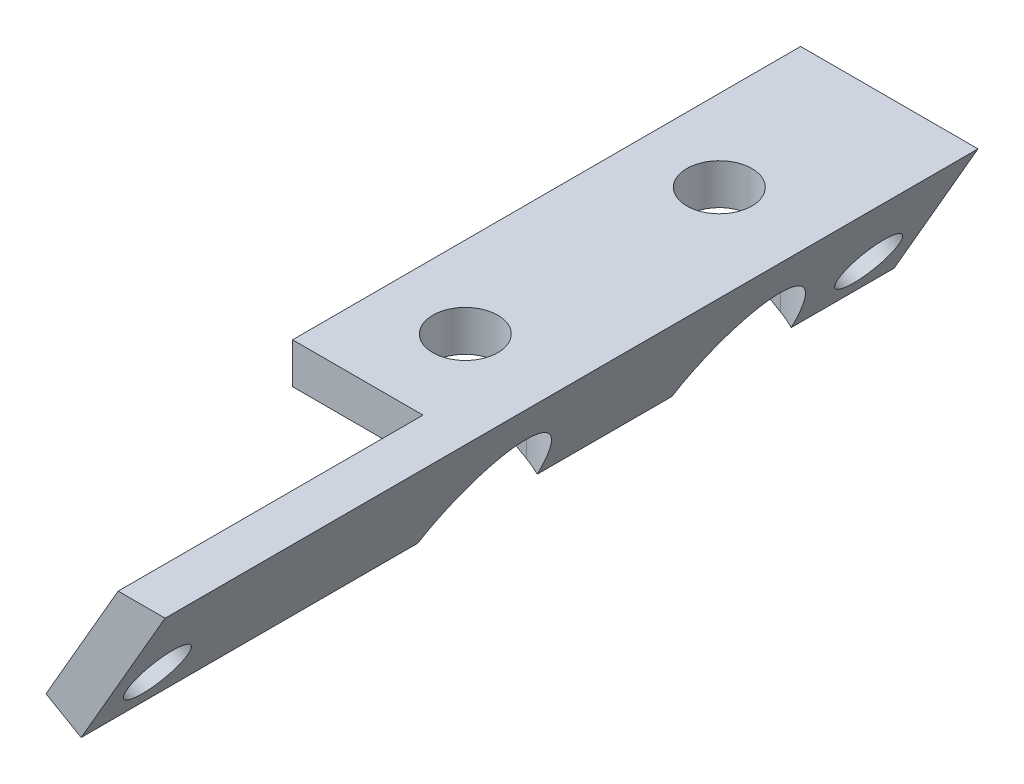
ISO-10303-21;
HEADER;
FILE_DESCRIPTION(('STEP AP214'),'2;1');
FILE_NAME('part.step','',(''),(''),'','','');
FILE_SCHEMA(('AUTOMOTIVE_DESIGN { 1 0 10303 214 1 1 1 1 }'));
ENDSEC;
DATA;
#1=APPLICATION_CONTEXT('core data for automotive mechanical design processes');
#2=APPLICATION_PROTOCOL_DEFINITION('international standard','automotive_design',2000,#1);
#3=PRODUCT_CONTEXT('',#1,'mechanical');
#4=PRODUCT('Part','Part','',(#3));
#5=PRODUCT_RELATED_PRODUCT_CATEGORY('part','',(#4));
#6=PRODUCT_DEFINITION_FORMATION('','',#4);
#7=PRODUCT_DEFINITION_CONTEXT('part definition',#1,'design');
#8=PRODUCT_DEFINITION('design','',#6,#7);
#9=PRODUCT_DEFINITION_SHAPE('','',#8);
#10=(LENGTH_UNIT() NAMED_UNIT(*) SI_UNIT(.MILLI.,.METRE.));
#11=(NAMED_UNIT(*) PLANE_ANGLE_UNIT() SI_UNIT($,.RADIAN.));
#12=(NAMED_UNIT(*) SI_UNIT($,.STERADIAN.) SOLID_ANGLE_UNIT());
#13=UNCERTAINTY_MEASURE_WITH_UNIT(LENGTH_MEASURE(1.E-05),#10,'distance_accuracy_value','');
#14=(GEOMETRIC_REPRESENTATION_CONTEXT(3) GLOBAL_UNCERTAINTY_ASSIGNED_CONTEXT((#13)) GLOBAL_UNIT_ASSIGNED_CONTEXT((#10,
#11,#12)) REPRESENTATION_CONTEXT('',''));
#15=CARTESIAN_POINT('',(0.,0.,0.));
#16=DIRECTION('',(0.,0.,1.));
#17=DIRECTION('',(1.,0.,0.));
#18=AXIS2_PLACEMENT_3D('',#15,#16,#17);
#19=CARTESIAN_POINT('',(0.,0.,25.));
#20=DIRECTION('',(0.500000000000004,0.866025403784437,0.));
#21=DIRECTION('',(-0.866025403784437,0.500000000000004,0.));
#22=AXIS2_PLACEMENT_3D('',#19,#20,#21);
#23=PLANE('',#22);
#24=CARTESIAN_POINT('',(-0.599999999999997,0.346410161513777,20.5));
#25=DIRECTION('',(0.500000000000004,0.866025403784437,0.));
#26=DIRECTION('',(-0.866025403784437,0.500000000000004,0.));
#27=AXIS2_PLACEMENT_3D('',#24,#25,#26);
#28=ELLIPSE('',#27,3.46410161513776,3.);
#29=CARTESIAN_POINT('',(-0.599999999999997,0.346410161513777,17.5));
#30=VERTEX_POINT('',#29);
#31=CARTESIAN_POINT('',(0.,0.,17.5606123086602));
#32=VERTEX_POINT('',#31);
#33=EDGE_CURVE('E276',#30,#32,#28,.F.);
#34=ORIENTED_EDGE('',*,*,#33,.F.);
#35=DIRECTION('',(0.866025403784437,-0.500000000000004,0.));
#36=VECTOR('',#35,1.);
#37=CARTESIAN_POINT('',(0.,0.,17.5));
#38=LINE('',#37,#36);
#39=CARTESIAN_POINT('',(-1.73205080756887,1.00000000000001,17.5));
#40=VERTEX_POINT('',#39);
#41=EDGE_CURVE('E286',#40,#30,#38,.T.);
#42=ORIENTED_EDGE('',*,*,#41,.F.);
#43=DIRECTION('',(0.,0.,-1.));
#44=VECTOR('',#43,1.);
#45=CARTESIAN_POINT('',(-1.73205080756887,1.00000000000001,25.));
#46=LINE('',#45,#44);
#47=CARTESIAN_POINT('',(-1.73205080756887,1.00000000000001,11.));
#48=VERTEX_POINT('',#47);
#49=EDGE_CURVE('E185',#40,#48,#46,.T.);
#50=ORIENTED_EDGE('',*,*,#49,.T.);
#51=DIRECTION('',(-0.866025403784437,0.500000000000004,0.));
#52=VECTOR('',#51,1.);
#53=CARTESIAN_POINT('',(0.,0.,11.));
#54=LINE('',#53,#52);
#55=CARTESIAN_POINT('',(-0.599999999999999,0.346410161513778,11.));
#56=VERTEX_POINT('',#55);
#57=EDGE_CURVE('E290',#56,#48,#54,.T.);
#58=ORIENTED_EDGE('',*,*,#57,.F.);
#59=CARTESIAN_POINT('',(-0.599999999999999,0.346410161513778,8.));
#60=DIRECTION('',(0.500000000000004,0.866025403784437,0.));
#61=DIRECTION('',(-0.866025403784437,0.500000000000004,0.));
#62=AXIS2_PLACEMENT_3D('',#59,#60,#61);
#63=ELLIPSE('',#62,3.46410161513776,3.);
#64=CARTESIAN_POINT('',(0.,0.,10.9393876913398));
#65=VERTEX_POINT('',#64);
#66=EDGE_CURVE('E295',#65,#56,#63,.F.);
#67=ORIENTED_EDGE('',*,*,#66,.F.);
#68=DIRECTION('',(0.,0.,-1.));
#69=VECTOR('',#68,1.);
#70=CARTESIAN_POINT('',(0.,0.,25.));
#71=LINE('',#70,#69);
#72=EDGE_CURVE('E203',#32,#65,#71,.T.);
#73=ORIENTED_EDGE('',*,*,#72,.F.);
#74=EDGE_LOOP('',(#34,#42,#50,#58,#67,#73));
#75=FACE_BOUND('',#74,.T.);
#76=ADVANCED_FACE('F32',(#75),#23,.F.);
#77=CARTESIAN_POINT('',(-0.599999999999997,0.346410161513777,20.5));
#78=DIRECTION('',(0.500000000000004,0.866025403784437,0.));
#79=DIRECTION('',(-0.866025403784437,0.500000000000004,0.));
#80=AXIS2_PLACEMENT_3D('',#77,#78,#79);
#81=ELLIPSE('',#80,3.46410161513776,3.);
#82=CARTESIAN_POINT('',(0.,0.,23.4393876913398));
#83=VERTEX_POINT('',#82);
#84=CARTESIAN_POINT('',(-0.599999999999997,0.346410161513777,23.5));
#85=VERTEX_POINT('',#84);
#86=EDGE_CURVE('E278',#83,#85,#81,.F.);
#87=ORIENTED_EDGE('',*,*,#86,.F.);
#88=CARTESIAN_POINT('',(0.,0.,40.));
#89=VERTEX_POINT('',#88);
#90=EDGE_CURVE('E201',#89,#83,#71,.T.);
#91=ORIENTED_EDGE('',*,*,#90,.F.);
#92=DIRECTION('',(0.866025403784436,-0.500000000000004,0.));
#93=VECTOR('',#92,1.);
#94=CARTESIAN_POINT('',(0.,0.,40.));
#95=LINE('',#94,#93);
#96=CARTESIAN_POINT('',(-1.73205080756887,1.00000000000001,40.));
#97=VERTEX_POINT('',#96);
#98=EDGE_CURVE('E241',#97,#89,#95,.T.);
#99=ORIENTED_EDGE('',*,*,#98,.F.);
#100=CARTESIAN_POINT('',(-1.73205080756887,1.00000000000001,23.5));
#101=VERTEX_POINT('',#100);
#102=EDGE_CURVE('E181',#97,#101,#46,.T.);
#103=ORIENTED_EDGE('',*,*,#102,.T.);
#104=DIRECTION('',(-0.866025403784437,0.500000000000004,0.));
#105=VECTOR('',#104,1.);
#106=CARTESIAN_POINT('',(0.,0.,23.5));
#107=LINE('',#106,#105);
#108=EDGE_CURVE('E282',#85,#101,#107,.T.);
#109=ORIENTED_EDGE('',*,*,#108,.F.);
#110=EDGE_LOOP('',(#87,#91,#99,#103,#109));
#111=FACE_BOUND('',#110,.T.);
#112=ADVANCED_FACE('F335',(#111),#23,.F.);
#113=CARTESIAN_POINT('',(-1.73205080756887,1.00000000000001,25.));
#114=DIRECTION('',(0.866025403784437,-0.500000000000004,0.));
#115=DIRECTION('',(0.500000000000004,0.866025403784437,0.));
#116=AXIS2_PLACEMENT_3D('',#113,#114,#115);
#117=PLANE('',#116);
#118=CARTESIAN_POINT('',(-0.599999999999997,2.96076951545866,20.5));
#119=DIRECTION('',(0.866025403784437,-0.500000000000004,0.));
#120=DIRECTION('',(0.500000000000004,0.866025403784437,0.));
#121=AXIS2_PLACEMENT_3D('',#118,#119,#120);
#122=ELLIPSE('',#121,5.99999999999995,3.);
#123=CARTESIAN_POINT('',(0.663952809568096,5.15,17.7792605241984));
#124=VERTEX_POINT('',#123);
#125=CARTESIAN_POINT('',(-0.599999999999998,2.96076951545866,17.5));
#126=VERTEX_POINT('',#125);
#127=EDGE_CURVE('E268',#124,#126,#122,.F.);
#128=ORIENTED_EDGE('',*,*,#127,.F.);
#129=DIRECTION('',(0.,0.,-1.));
#130=VECTOR('',#129,1.);
#131=CARTESIAN_POINT('',(0.663952809568095,5.15,25.));
#132=LINE('',#131,#130);
#133=CARTESIAN_POINT('',(0.663952809568095,5.15,10.7207394758016));
#134=VERTEX_POINT('',#133);
#135=EDGE_CURVE('E180',#124,#134,#132,.T.);
#136=ORIENTED_EDGE('',*,*,#135,.T.);
#137=CARTESIAN_POINT('',(-0.599999999999999,2.96076951545866,8.));
#138=DIRECTION('',(0.866025403784437,-0.500000000000004,0.));
#139=DIRECTION('',(0.500000000000004,0.866025403784437,0.));
#140=AXIS2_PLACEMENT_3D('',#137,#138,#139);
#141=ELLIPSE('',#140,5.99999999999995,3.);
#142=CARTESIAN_POINT('',(-0.599999999999999,2.96076951545865,11.));
#143=VERTEX_POINT('',#142);
#144=EDGE_CURVE('E162',#143,#134,#141,.F.);
#145=ORIENTED_EDGE('',*,*,#144,.F.);
#146=DIRECTION('',(0.500000000000004,0.866025403784437,0.));
#147=VECTOR('',#146,1.);
#148=CARTESIAN_POINT('',(-1.73205080756887,1.,11.));
#149=LINE('',#148,#147);
#150=EDGE_CURVE('E292',#48,#143,#149,.T.);
#151=ORIENTED_EDGE('',*,*,#150,.F.);
#152=ORIENTED_EDGE('',*,*,#49,.F.);
#153=DIRECTION('',(-0.500000000000004,-0.866025403784437,0.));
#154=VECTOR('',#153,1.);
#155=CARTESIAN_POINT('',(-1.73205080756887,1.00000000000001,17.5));
#156=LINE('',#155,#154);
#157=EDGE_CURVE('E288',#126,#40,#156,.T.);
#158=ORIENTED_EDGE('',*,*,#157,.F.);
#159=EDGE_LOOP('',(#128,#136,#145,#151,#152,#158));
#160=FACE_BOUND('',#159,.T.);
#161=ADVANCED_FACE('F315',(#160),#117,.F.);
#162=CARTESIAN_POINT('',(-0.482050807568864,3.1650635094611,37.5));
#163=DIRECTION('',(0.866025403784437,-0.500000000000004,0.));
#164=DIRECTION('',(0.500000000000004,0.866025403784437,0.));
#165=AXIS2_PLACEMENT_3D('',#162,#163,#164);
#166=CIRCLE('',#165,1.5);
#167=CARTESIAN_POINT('',(0.267949192431144,4.46410161513776,37.5));
#168=VERTEX_POINT('',#167);
#169=EDGE_CURVE('E238',#168,#168,#166,.F.);
#170=ORIENTED_EDGE('',*,*,#169,.F.);
#171=EDGE_LOOP('',(#170));
#172=FACE_BOUND('',#171,.T.);
#173=CARTESIAN_POINT('',(-0.599999999999997,2.96076951545866,20.5));
#174=DIRECTION('',(0.866025403784437,-0.500000000000004,0.));
#175=DIRECTION('',(0.500000000000004,0.866025403784437,0.));
#176=AXIS2_PLACEMENT_3D('',#173,#174,#175);
#177=ELLIPSE('',#176,5.99999999999995,3.);
#178=CARTESIAN_POINT('',(-0.599999999999998,2.96076951545866,23.5));
#179=VERTEX_POINT('',#178);
#180=CARTESIAN_POINT('',(0.663952809568096,5.15,23.2207394758016));
#181=VERTEX_POINT('',#180);
#182=EDGE_CURVE('E274',#179,#181,#177,.F.);
#183=ORIENTED_EDGE('',*,*,#182,.F.);
#184=DIRECTION('',(0.500000000000004,0.866025403784437,0.));
#185=VECTOR('',#184,1.);
#186=CARTESIAN_POINT('',(-1.73205080756887,1.00000000000001,23.5));
#187=LINE('',#186,#185);
#188=EDGE_CURVE('E284',#101,#179,#187,.T.);
#189=ORIENTED_EDGE('',*,*,#188,.F.);
#190=ORIENTED_EDGE('',*,*,#102,.F.);
#191=DIRECTION('',(-0.500000000000004,-0.866025403784436,0.));
#192=VECTOR('',#191,1.);
#193=CARTESIAN_POINT('',(-1.73205080756887,1.00000000000001,40.));
#194=LINE('',#193,#192);
#195=CARTESIAN_POINT('',(1.81865334794736,7.15,40.));
#196=VERTEX_POINT('',#195);
#197=EDGE_CURVE('E244',#196,#97,#194,.T.);
#198=ORIENTED_EDGE('',*,*,#197,.F.);
#199=DIRECTION('',(0.,0.,-1.));
#200=VECTOR('',#199,1.);
#201=CARTESIAN_POINT('',(1.81865334794736,7.15,40.));
#202=LINE('',#201,#200);
#203=CARTESIAN_POINT('',(1.81865334794736,7.15,25.));
#204=VERTEX_POINT('',#203);
#205=EDGE_CURVE('E229',#196,#204,#202,.T.);
#206=ORIENTED_EDGE('',*,*,#205,.T.);
#207=DIRECTION('',(-0.500000000000004,-0.866025403784436,0.));
#208=VECTOR('',#207,1.);
#209=CARTESIAN_POINT('',(-1.73205080756887,1.00000000000001,25.));
#210=LINE('',#209,#208);
#211=CARTESIAN_POINT('',(0.663952809568095,5.15,25.));
#212=VERTEX_POINT('',#211);
#213=EDGE_CURVE('E46',#204,#212,#210,.T.);
#214=ORIENTED_EDGE('',*,*,#213,.T.);
#215=EDGE_CURVE('E183',#212,#181,#132,.T.);
#216=ORIENTED_EDGE('',*,*,#215,.T.);
#217=EDGE_LOOP('',(#183,#189,#190,#198,#206,#214,#216));
#218=FACE_BOUND('',#217,.T.);
#219=ADVANCED_FACE('F341',(#172,#218),#117,.F.);
#220=CARTESIAN_POINT('',(-0.599999999999999,0.346410161513778,8.));
#221=DIRECTION('',(0.500000000000004,0.866025403784437,0.));
#222=DIRECTION('',(-0.866025403784437,0.500000000000004,0.));
#223=AXIS2_PLACEMENT_3D('',#220,#221,#222);
#224=ELLIPSE('',#223,3.46410161513776,3.);
#225=CARTESIAN_POINT('',(-0.599999999999999,0.346410161513778,5.));
#226=VERTEX_POINT('',#225);
#227=CARTESIAN_POINT('',(0.,0.,5.06061230866019));
#228=VERTEX_POINT('',#227);
#229=EDGE_CURVE('E210',#226,#228,#224,.F.);
#230=ORIENTED_EDGE('',*,*,#229,.F.);
#231=DIRECTION('',(0.866025403784437,-0.500000000000004,0.));
#232=VECTOR('',#231,1.);
#233=CARTESIAN_POINT('',(0.,0.,5.));
#234=LINE('',#233,#232);
#235=CARTESIAN_POINT('',(-1.73205080756887,1.00000000000001,5.));
#236=VERTEX_POINT('',#235);
#237=EDGE_CURVE('E206',#236,#226,#234,.T.);
#238=ORIENTED_EDGE('',*,*,#237,.F.);
#239=CARTESIAN_POINT('',(-1.73205080756887,1.00000000000001,0.));
#240=VERTEX_POINT('',#239);
#241=EDGE_CURVE('E79',#236,#240,#46,.T.);
#242=ORIENTED_EDGE('',*,*,#241,.T.);
#243=DIRECTION('',(0.866025403784436,-0.500000000000004,0.));
#244=VECTOR('',#243,1.);
#245=CARTESIAN_POINT('',(0.,0.,0.));
#246=LINE('',#245,#244);
#247=CARTESIAN_POINT('',(0.,0.,0.));
#248=VERTEX_POINT('',#247);
#249=EDGE_CURVE('E228',#240,#248,#246,.T.);
#250=ORIENTED_EDGE('',*,*,#249,.T.);
#251=EDGE_CURVE('E200',#228,#248,#71,.T.);
#252=ORIENTED_EDGE('',*,*,#251,.F.);
#253=EDGE_LOOP('',(#230,#238,#242,#250,#252));
#254=FACE_BOUND('',#253,.T.);
#255=ADVANCED_FACE('F208',(#254),#23,.F.);
#256=CARTESIAN_POINT('',(0.,0.,25.));
#257=DIRECTION('',(-0.866025403784436,0.500000000000004,0.));
#258=DIRECTION('',(-0.500000000000004,-0.866025403784436,0.));
#259=AXIS2_PLACEMENT_3D('',#256,#257,#258);
#260=PLANE('',#259);
#261=CARTESIAN_POINT('',(1.25000000000001,2.16506350946109,37.5));
#262=DIRECTION('',(0.866025403784436,-0.500000000000004,0.));
#263=DIRECTION('',(0.500000000000004,0.866025403784436,0.));
#264=AXIS2_PLACEMENT_3D('',#261,#262,#263);
#265=CIRCLE('',#264,1.5);
#266=CARTESIAN_POINT('',(2.00000000000002,3.46410161513775,37.5));
#267=VERTEX_POINT('',#266);
#268=EDGE_CURVE('E252',#267,#267,#265,.T.);
#269=ORIENTED_EDGE('',*,*,#268,.F.);
#270=EDGE_LOOP('',(#269));
#271=FACE_BOUND('',#270,.T.);
#272=CARTESIAN_POINT('',(1.25000000000001,2.16506350946109,2.5));
#273=DIRECTION('',(0.866025403784436,-0.500000000000004,0.));
#274=DIRECTION('',(0.500000000000004,0.866025403784436,0.));
#275=AXIS2_PLACEMENT_3D('',#272,#273,#274);
#276=CIRCLE('',#275,1.5);
#277=CARTESIAN_POINT('',(2.00000000000002,3.46410161513775,2.5));
#278=VERTEX_POINT('',#277);
#279=EDGE_CURVE('E253',#278,#278,#276,.T.);
#280=ORIENTED_EDGE('',*,*,#279,.F.);
#281=EDGE_LOOP('',(#280));
#282=FACE_BOUND('',#281,.T.);
#283=CARTESIAN_POINT('',(-0.599999999999997,-1.03923048454131,20.5));
#284=DIRECTION('',(-0.866025403784436,0.500000000000004,0.));
#285=DIRECTION('',(0.500000000000004,0.866025403784436,0.));
#286=AXIS2_PLACEMENT_3D('',#283,#284,#285);
#287=ELLIPSE('',#286,5.99999999999995,3.);
#288=EDGE_CURVE('E280',#32,#83,#287,.F.);
#289=ORIENTED_EDGE('',*,*,#288,.F.);
#290=ORIENTED_EDGE('',*,*,#72,.T.);
#291=CARTESIAN_POINT('',(-0.599999999999998,-1.03923048454131,8.));
#292=DIRECTION('',(-0.866025403784436,0.500000000000004,0.));
#293=DIRECTION('',(0.500000000000004,0.866025403784436,0.));
#294=AXIS2_PLACEMENT_3D('',#291,#292,#293);
#295=ELLIPSE('',#294,5.99999999999995,3.);
#296=EDGE_CURVE('E211',#228,#65,#295,.F.);
#297=ORIENTED_EDGE('',*,*,#296,.F.);
#298=ORIENTED_EDGE('',*,*,#251,.T.);
#299=DIRECTION('',(0.500000000000004,0.866025403784436,0.));
#300=VECTOR('',#299,1.);
#301=CARTESIAN_POINT('',(0.,0.,0.));
#302=LINE('',#301,#300);
#303=CARTESIAN_POINT('',(4.12805442470587,7.15,0.));
#304=VERTEX_POINT('',#303);
#305=EDGE_CURVE('E226',#248,#304,#302,.T.);
#306=ORIENTED_EDGE('',*,*,#305,.T.);
#307=DIRECTION('',(0.,0.,-1.));
#308=VECTOR('',#307,1.);
#309=CARTESIAN_POINT('',(4.12805442470587,7.15,25.));
#310=LINE('',#309,#308);
#311=CARTESIAN_POINT('',(4.12805442470587,7.15,40.));
#312=VERTEX_POINT('',#311);
#313=EDGE_CURVE('E195',#312,#304,#310,.T.);
#314=ORIENTED_EDGE('',*,*,#313,.F.);
#315=DIRECTION('',(0.500000000000004,0.866025403784436,0.));
#316=VECTOR('',#315,1.);
#317=CARTESIAN_POINT('',(4.12805442470587,7.15,40.));
#318=LINE('',#317,#316);
#319=EDGE_CURVE('E235',#89,#312,#318,.T.);
#320=ORIENTED_EDGE('',*,*,#319,.F.);
#321=ORIENTED_EDGE('',*,*,#90,.T.);
#322=EDGE_LOOP('',(#289,#290,#297,#298,#306,#314,#320,#321));
#323=FACE_BOUND('',#322,.T.);
#324=ADVANCED_FACE('F330',(#271,#282,#323),#260,.F.);
#325=CARTESIAN_POINT('',(-0.482050807568864,3.1650635094611,2.5));
#326=DIRECTION('',(0.866025403784437,-0.500000000000004,0.));
#327=DIRECTION('',(0.500000000000004,0.866025403784437,0.));
#328=AXIS2_PLACEMENT_3D('',#325,#326,#327);
#329=CIRCLE('',#328,1.5);
#330=CARTESIAN_POINT('',(0.267949192431142,4.46410161513775,2.5));
#331=VERTEX_POINT('',#330);
#332=EDGE_CURVE('E249',#331,#331,#329,.F.);
#333=ORIENTED_EDGE('',*,*,#332,.F.);
#334=EDGE_LOOP('',(#333));
#335=FACE_BOUND('',#334,.T.);
#336=CARTESIAN_POINT('',(-0.599999999999999,2.96076951545866,8.));
#337=DIRECTION('',(0.866025403784437,-0.500000000000004,0.));
#338=DIRECTION('',(0.500000000000004,0.866025403784437,0.));
#339=AXIS2_PLACEMENT_3D('',#336,#337,#338);
#340=ELLIPSE('',#339,5.99999999999995,3.);
#341=CARTESIAN_POINT('',(0.663952809568095,5.15,5.27926052419845));
#342=VERTEX_POINT('',#341);
#343=CARTESIAN_POINT('',(-0.599999999999999,2.96076951545866,5.));
#344=VERTEX_POINT('',#343);
#345=EDGE_CURVE('E11',#342,#344,#340,.F.);
#346=ORIENTED_EDGE('',*,*,#345,.F.);
#347=CARTESIAN_POINT('',(0.663952809568095,5.15,0.));
#348=VERTEX_POINT('',#347);
#349=EDGE_CURVE('E172',#342,#348,#132,.T.);
#350=ORIENTED_EDGE('',*,*,#349,.T.);
#351=DIRECTION('',(-0.500000000000004,-0.866025403784436,0.));
#352=VECTOR('',#351,1.);
#353=CARTESIAN_POINT('',(-1.73205080756887,1.00000000000001,0.));
#354=LINE('',#353,#352);
#355=EDGE_CURVE('E214',#348,#240,#354,.T.);
#356=ORIENTED_EDGE('',*,*,#355,.T.);
#357=ORIENTED_EDGE('',*,*,#241,.F.);
#358=DIRECTION('',(-0.500000000000004,-0.866025403784437,0.));
#359=VECTOR('',#358,1.);
#360=CARTESIAN_POINT('',(-1.73205080756887,1.,5.));
#361=LINE('',#360,#359);
#362=EDGE_CURVE('E39',#344,#236,#361,.T.);
#363=ORIENTED_EDGE('',*,*,#362,.F.);
#364=EDGE_LOOP('',(#346,#350,#356,#357,#363));
#365=FACE_BOUND('',#364,.T.);
#366=ADVANCED_FACE('F171',(#335,#365),#117,.F.);
#367=CARTESIAN_POINT('',(-0.599999999999997,-0.001000000000001,20.5));
#368=DIRECTION('',(0.,1.,0.));
#369=DIRECTION('',(-1.,0.,0.));
#370=AXIS2_PLACEMENT_3D('',#367,#368,#369);
#371=CYLINDRICAL_SURFACE('',#370,1.6);
#372=CARTESIAN_POINT('',(-0.599999999999998,7.15,20.5));
#373=DIRECTION('',(0.,1.,0.));
#374=DIRECTION('',(-1.,0.,0.));
#375=AXIS2_PLACEMENT_3D('',#372,#373,#374);
#376=CIRCLE('',#375,1.6);
#377=CARTESIAN_POINT('',(-2.2,7.15,20.5));
#378=VERTEX_POINT('',#377);
#379=EDGE_CURVE('E265',#378,#378,#376,.T.);
#380=ORIENTED_EDGE('',*,*,#379,.T.);
#381=EDGE_LOOP('',(#380));
#382=FACE_BOUND('',#381,.T.);
#383=CARTESIAN_POINT('',(-0.599999999999998,5.15,20.5));
#384=DIRECTION('',(0.,1.,0.));
#385=DIRECTION('',(-1.,0.,0.));
#386=AXIS2_PLACEMENT_3D('',#383,#384,#385);
#387=CIRCLE('',#386,1.6);
#388=CARTESIAN_POINT('',(-2.2,5.15,20.5));
#389=VERTEX_POINT('',#388);
#390=EDGE_CURVE('E261',#389,#389,#387,.F.);
#391=ORIENTED_EDGE('',*,*,#390,.T.);
#392=EDGE_LOOP('',(#391));
#393=FACE_BOUND('',#392,.T.);
#394=ADVANCED_FACE('F373',(#382,#393),#371,.F.);
#395=CARTESIAN_POINT('',(-0.599999999999999,-0.001000000000001,8.));
#396=DIRECTION('',(0.,1.,0.));
#397=DIRECTION('',(-1.,0.,0.));
#398=AXIS2_PLACEMENT_3D('',#395,#396,#397);
#399=CYLINDRICAL_SURFACE('',#398,1.6);
#400=CARTESIAN_POINT('',(-0.6,7.15,8.));
#401=DIRECTION('',(0.,1.,0.));
#402=DIRECTION('',(-1.,0.,0.));
#403=AXIS2_PLACEMENT_3D('',#400,#401,#402);
#404=CIRCLE('',#403,1.6);
#405=CARTESIAN_POINT('',(-2.2,7.15,8.));
#406=VERTEX_POINT('',#405);
#407=EDGE_CURVE('E264',#406,#406,#404,.T.);
#408=ORIENTED_EDGE('',*,*,#407,.T.);
#409=EDGE_LOOP('',(#408));
#410=FACE_BOUND('',#409,.T.);
#411=CARTESIAN_POINT('',(-0.599999999999999,5.15,8.));
#412=DIRECTION('',(0.,1.,0.));
#413=DIRECTION('',(-1.,0.,0.));
#414=AXIS2_PLACEMENT_3D('',#411,#412,#413);
#415=CIRCLE('',#414,1.6);
#416=CARTESIAN_POINT('',(-2.2,5.15,8.));
#417=VERTEX_POINT('',#416);
#418=EDGE_CURVE('E256',#417,#417,#415,.F.);
#419=ORIENTED_EDGE('',*,*,#418,.T.);
#420=EDGE_LOOP('',(#419));
#421=FACE_BOUND('',#420,.T.);
#422=ADVANCED_FACE('F378',(#410,#421),#399,.F.);
#423=CARTESIAN_POINT('',(0.,0.,25.));
#424=DIRECTION('',(0.,0.,-1.));
#425=DIRECTION('',(-1.,0.,0.));
#426=AXIS2_PLACEMENT_3D('',#423,#424,#425);
#427=PLANE('',#426);
#428=ORIENTED_EDGE('',*,*,#213,.F.);
#429=DIRECTION('',(-1.,0.,0.));
#430=VECTOR('',#429,1.);
#431=CARTESIAN_POINT('',(4.12805442470587,7.15,25.));
#432=LINE('',#431,#430);
#433=CARTESIAN_POINT('',(-4.6,7.15,25.));
#434=VERTEX_POINT('',#433);
#435=EDGE_CURVE('E81',#204,#434,#432,.T.);
#436=ORIENTED_EDGE('',*,*,#435,.T.);
#437=DIRECTION('',(0.,-1.,0.));
#438=VECTOR('',#437,1.);
#439=CARTESIAN_POINT('',(-4.6,5.15,25.));
#440=LINE('',#439,#438);
#441=CARTESIAN_POINT('',(-4.6,5.15,25.));
#442=VERTEX_POINT('',#441);
#443=EDGE_CURVE('E217',#434,#442,#440,.T.);
#444=ORIENTED_EDGE('',*,*,#443,.T.);
#445=DIRECTION('',(1.,0.,0.));
#446=VECTOR('',#445,1.);
#447=CARTESIAN_POINT('',(0.663952809568095,5.15,25.));
#448=LINE('',#447,#446);
#449=EDGE_CURVE('E52',#442,#212,#448,.T.);
#450=ORIENTED_EDGE('',*,*,#449,.T.);
#451=EDGE_LOOP('',(#428,#436,#444,#450));
#452=FACE_BOUND('',#451,.T.);
#453=ADVANCED_FACE('F398',(#452),#427,.F.);
#454=CARTESIAN_POINT('',(4.12805442470587,7.15,25.));
#455=DIRECTION('',(0.,-1.,0.));
#456=DIRECTION('',(1.,0.,0.));
#457=AXIS2_PLACEMENT_3D('',#454,#455,#456);
#458=PLANE('',#457);
#459=ORIENTED_EDGE('',*,*,#407,.F.);
#460=EDGE_LOOP('',(#459));
#461=FACE_BOUND('',#460,.T.);
#462=ORIENTED_EDGE('',*,*,#379,.F.);
#463=EDGE_LOOP('',(#462));
#464=FACE_BOUND('',#463,.T.);
#465=DIRECTION('',(-1.,0.,0.));
#466=VECTOR('',#465,1.);
#467=CARTESIAN_POINT('',(4.12805442470587,7.15,0.));
#468=LINE('',#467,#466);
#469=CARTESIAN_POINT('',(-4.6,7.15,0.));
#470=VERTEX_POINT('',#469);
#471=EDGE_CURVE('E224',#304,#470,#468,.T.);
#472=ORIENTED_EDGE('',*,*,#471,.T.);
#473=DIRECTION('',(0.,0.,-1.));
#474=VECTOR('',#473,1.);
#475=CARTESIAN_POINT('',(-4.6,7.15,25.));
#476=LINE('',#475,#474);
#477=EDGE_CURVE('E192',#434,#470,#476,.T.);
#478=ORIENTED_EDGE('',*,*,#477,.F.);
#479=ORIENTED_EDGE('',*,*,#435,.F.);
#480=ORIENTED_EDGE('',*,*,#205,.F.);
#481=DIRECTION('',(-1.,0.,0.));
#482=VECTOR('',#481,1.);
#483=CARTESIAN_POINT('',(1.81865334794736,7.15,40.));
#484=LINE('',#483,#482);
#485=EDGE_CURVE('E237',#312,#196,#484,.T.);
#486=ORIENTED_EDGE('',*,*,#485,.F.);
#487=ORIENTED_EDGE('',*,*,#313,.T.);
#488=EDGE_LOOP('',(#472,#478,#479,#480,#486,#487));
#489=FACE_BOUND('',#488,.T.);
#490=ADVANCED_FACE('F400',(#461,#464,#489),#458,.F.);
#491=CARTESIAN_POINT('',(-4.6,5.15,25.));
#492=DIRECTION('',(1.,0.,0.));
#493=DIRECTION('',(0.,0.,-1.));
#494=AXIS2_PLACEMENT_3D('',#491,#492,#493);
#495=PLANE('',#494);
#496=DIRECTION('',(0.,-1.,0.));
#497=VECTOR('',#496,1.);
#498=CARTESIAN_POINT('',(-4.6,5.15,0.));
#499=LINE('',#498,#497);
#500=CARTESIAN_POINT('',(-4.6,5.15,0.));
#501=VERTEX_POINT('',#500);
#502=EDGE_CURVE('E222',#470,#501,#499,.T.);
#503=ORIENTED_EDGE('',*,*,#502,.T.);
#504=DIRECTION('',(0.,0.,-1.));
#505=VECTOR('',#504,1.);
#506=CARTESIAN_POINT('',(-4.6,5.15,25.));
#507=LINE('',#506,#505);
#508=EDGE_CURVE('E189',#442,#501,#507,.T.);
#509=ORIENTED_EDGE('',*,*,#508,.F.);
#510=ORIENTED_EDGE('',*,*,#443,.F.);
#511=ORIENTED_EDGE('',*,*,#477,.T.);
#512=EDGE_LOOP('',(#503,#509,#510,#511));
#513=FACE_BOUND('',#512,.T.);
#514=ADVANCED_FACE('F406',(#513),#495,.F.);
#515=CARTESIAN_POINT('',(0.663952809568095,5.15,25.));
#516=DIRECTION('',(0.,1.,0.));
#517=DIRECTION('',(-1.,0.,0.));
#518=AXIS2_PLACEMENT_3D('',#515,#516,#517);
#519=PLANE('',#518);
#520=ORIENTED_EDGE('',*,*,#135,.F.);
#521=CARTESIAN_POINT('',(-0.599999999999998,5.15,20.5));
#522=DIRECTION('',(0.,-1.,0.));
#523=DIRECTION('',(1.,0.,0.));
#524=AXIS2_PLACEMENT_3D('',#521,#522,#523);
#525=CIRCLE('',#524,3.);
#526=EDGE_CURVE('E301',#124,#181,#525,.T.);
#527=ORIENTED_EDGE('',*,*,#526,.T.);
#528=ORIENTED_EDGE('',*,*,#215,.F.);
#529=ORIENTED_EDGE('',*,*,#449,.F.);
#530=ORIENTED_EDGE('',*,*,#508,.T.);
#531=DIRECTION('',(1.,0.,0.));
#532=VECTOR('',#531,1.);
#533=CARTESIAN_POINT('',(0.663952809568095,5.15,0.));
#534=LINE('',#533,#532);
#535=EDGE_CURVE('E178',#501,#348,#534,.T.);
#536=ORIENTED_EDGE('',*,*,#535,.T.);
#537=ORIENTED_EDGE('',*,*,#349,.F.);
#538=CARTESIAN_POINT('',(-0.599999999999999,5.15,8.));
#539=DIRECTION('',(0.,-1.,0.));
#540=DIRECTION('',(1.,0.,0.));
#541=AXIS2_PLACEMENT_3D('',#538,#539,#540);
#542=CIRCLE('',#541,3.);
#543=EDGE_CURVE('E155',#342,#134,#542,.T.);
#544=ORIENTED_EDGE('',*,*,#543,.T.);
#545=EDGE_LOOP('',(#520,#527,#528,#529,#530,#536,#537,#544));
#546=FACE_BOUND('',#545,.T.);
#547=ORIENTED_EDGE('',*,*,#418,.F.);
#548=EDGE_LOOP('',(#547));
#549=FACE_BOUND('',#548,.T.);
#550=ORIENTED_EDGE('',*,*,#390,.F.);
#551=EDGE_LOOP('',(#550));
#552=FACE_BOUND('',#551,.T.);
#553=ADVANCED_FACE('F174',(#546,#549,#552),#519,.F.);
#554=CARTESIAN_POINT('',(0.,0.,0.));
#555=DIRECTION('',(0.,0.,-1.));
#556=DIRECTION('',(-1.,0.,0.));
#557=AXIS2_PLACEMENT_3D('',#554,#555,#556);
#558=PLANE('',#557);
#559=ORIENTED_EDGE('',*,*,#249,.F.);
#560=ORIENTED_EDGE('',*,*,#355,.F.);
#561=ORIENTED_EDGE('',*,*,#535,.F.);
#562=ORIENTED_EDGE('',*,*,#502,.F.);
#563=ORIENTED_EDGE('',*,*,#471,.F.);
#564=ORIENTED_EDGE('',*,*,#305,.F.);
#565=EDGE_LOOP('',(#559,#560,#561,#562,#563,#564));
#566=FACE_BOUND('',#565,.T.);
#567=ADVANCED_FACE('F395',(#566),#558,.T.);
#568=CARTESIAN_POINT('',(0.,0.,40.));
#569=DIRECTION('',(0.,0.,-1.));
#570=DIRECTION('',(-1.,0.,0.));
#571=AXIS2_PLACEMENT_3D('',#568,#569,#570);
#572=PLANE('',#571);
#573=ORIENTED_EDGE('',*,*,#485,.T.);
#574=ORIENTED_EDGE('',*,*,#197,.T.);
#575=ORIENTED_EDGE('',*,*,#98,.T.);
#576=ORIENTED_EDGE('',*,*,#319,.T.);
#577=EDGE_LOOP('',(#573,#574,#575,#576));
#578=FACE_BOUND('',#577,.T.);
#579=ADVANCED_FACE('F338',(#578),#572,.F.);
#580=CARTESIAN_POINT('',(-5.29722383123125,5.94510495086723,2.5));
#581=DIRECTION('',(0.866025403784436,-0.500000000000004,0.));
#582=DIRECTION('',(0.500000000000004,0.866025403784436,0.));
#583=AXIS2_PLACEMENT_3D('',#580,#581,#582);
#584=CYLINDRICAL_SURFACE('',#583,1.5);
#585=ORIENTED_EDGE('',*,*,#279,.T.);
#586=EDGE_LOOP('',(#585));
#587=FACE_BOUND('',#586,.T.);
#588=ORIENTED_EDGE('',*,*,#332,.T.);
#589=EDGE_LOOP('',(#588));
#590=FACE_BOUND('',#589,.T.);
#591=ADVANCED_FACE('F383',(#587,#590),#584,.F.);
#592=CARTESIAN_POINT('',(-5.29722383123125,5.94510495086723,37.5));
#593=DIRECTION('',(0.866025403784436,-0.500000000000004,0.));
#594=DIRECTION('',(0.500000000000004,0.866025403784436,0.));
#595=AXIS2_PLACEMENT_3D('',#592,#593,#594);
#596=CYLINDRICAL_SURFACE('',#595,1.5);
#597=ORIENTED_EDGE('',*,*,#268,.T.);
#598=EDGE_LOOP('',(#597));
#599=FACE_BOUND('',#598,.T.);
#600=ORIENTED_EDGE('',*,*,#169,.T.);
#601=EDGE_LOOP('',(#600));
#602=FACE_BOUND('',#601,.T.);
#603=ADVANCED_FACE('F385',(#599,#602),#596,.F.);
#604=CARTESIAN_POINT('',(-0.599999999999999,0.,11.));
#605=DIRECTION('',(0.,0.,-1.));
#606=DIRECTION('',(-1.,0.,0.));
#607=AXIS2_PLACEMENT_3D('',#604,#605,#606);
#608=PLANE('',#607);
#609=ORIENTED_EDGE('',*,*,#57,.T.);
#610=ORIENTED_EDGE('',*,*,#150,.T.);
#611=DIRECTION('',(0.,1.,0.));
#612=VECTOR('',#611,1.);
#613=CARTESIAN_POINT('',(-0.599999999999999,0.,11.));
#614=LINE('',#613,#612);
#615=EDGE_CURVE('E299',#56,#143,#614,.T.);
#616=ORIENTED_EDGE('',*,*,#615,.F.);
#617=EDGE_LOOP('',(#609,#610,#616));
#618=FACE_BOUND('',#617,.T.);
#619=ADVANCED_FACE('F392',(#618),#608,.T.);
#620=CARTESIAN_POINT('',(-0.599999999999999,0.,8.));
#621=DIRECTION('',(0.,1.,0.));
#622=DIRECTION('',(-1.,0.,0.));
#623=AXIS2_PLACEMENT_3D('',#620,#621,#622);
#624=CYLINDRICAL_SURFACE('',#623,3.);
#625=ORIENTED_EDGE('',*,*,#144,.T.);
#626=ORIENTED_EDGE('',*,*,#543,.F.);
#627=ORIENTED_EDGE('',*,*,#345,.T.);
#628=DIRECTION('',(0.,1.,0.));
#629=VECTOR('',#628,1.);
#630=CARTESIAN_POINT('',(-0.599999999999999,0.,5.));
#631=LINE('',#630,#629);
#632=EDGE_CURVE('E167',#226,#344,#631,.T.);
#633=ORIENTED_EDGE('',*,*,#632,.F.);
#634=ORIENTED_EDGE('',*,*,#229,.T.);
#635=ORIENTED_EDGE('',*,*,#296,.T.);
#636=ORIENTED_EDGE('',*,*,#66,.T.);
#637=ORIENTED_EDGE('',*,*,#615,.T.);
#638=EDGE_LOOP('',(#625,#626,#627,#633,#634,#635,#636,#637));
#639=FACE_BOUND('',#638,.T.);
#640=ADVANCED_FACE('F157',(#639),#624,.F.);
#641=CARTESIAN_POINT('',(-3.6,0.,5.));
#642=DIRECTION('',(0.,0.,1.));
#643=DIRECTION('',(1.,0.,0.));
#644=AXIS2_PLACEMENT_3D('',#641,#642,#643);
#645=PLANE('',#644);
#646=ORIENTED_EDGE('',*,*,#237,.T.);
#647=ORIENTED_EDGE('',*,*,#632,.T.);
#648=ORIENTED_EDGE('',*,*,#362,.T.);
#649=EDGE_LOOP('',(#646,#647,#648));
#650=FACE_BOUND('',#649,.T.);
#651=ADVANCED_FACE('F205',(#650),#645,.T.);
#652=CARTESIAN_POINT('',(-0.599999999999997,0.,20.5));
#653=DIRECTION('',(0.,1.,0.));
#654=DIRECTION('',(-1.,0.,0.));
#655=AXIS2_PLACEMENT_3D('',#652,#653,#654);
#656=CYLINDRICAL_SURFACE('',#655,3.);
#657=ORIENTED_EDGE('',*,*,#127,.T.);
#658=DIRECTION('',(0.,1.,0.));
#659=VECTOR('',#658,1.);
#660=CARTESIAN_POINT('',(-0.599999999999997,0.,17.5));
#661=LINE('',#660,#659);
#662=EDGE_CURVE('E305',#30,#126,#661,.T.);
#663=ORIENTED_EDGE('',*,*,#662,.F.);
#664=ORIENTED_EDGE('',*,*,#33,.T.);
#665=ORIENTED_EDGE('',*,*,#288,.T.);
#666=ORIENTED_EDGE('',*,*,#86,.T.);
#667=DIRECTION('',(0.,1.,0.));
#668=VECTOR('',#667,1.);
#669=CARTESIAN_POINT('',(-0.599999999999997,0.,23.5));
#670=LINE('',#669,#668);
#671=EDGE_CURVE('E212',#85,#179,#670,.T.);
#672=ORIENTED_EDGE('',*,*,#671,.T.);
#673=ORIENTED_EDGE('',*,*,#182,.T.);
#674=ORIENTED_EDGE('',*,*,#526,.F.);
#675=EDGE_LOOP('',(#657,#663,#664,#665,#666,#672,#673,#674));
#676=FACE_BOUND('',#675,.T.);
#677=ADVANCED_FACE('F311',(#676),#656,.F.);
#678=CARTESIAN_POINT('',(-0.599999999999997,0.,23.5));
#679=DIRECTION('',(0.,0.,-1.));
#680=DIRECTION('',(-1.,0.,0.));
#681=AXIS2_PLACEMENT_3D('',#678,#679,#680);
#682=PLANE('',#681);
#683=ORIENTED_EDGE('',*,*,#108,.T.);
#684=ORIENTED_EDGE('',*,*,#188,.T.);
#685=ORIENTED_EDGE('',*,*,#671,.F.);
#686=EDGE_LOOP('',(#683,#684,#685));
#687=FACE_BOUND('',#686,.T.);
#688=ADVANCED_FACE('F345',(#687),#682,.T.);
#689=CARTESIAN_POINT('',(-3.6,0.,17.5));
#690=DIRECTION('',(0.,0.,1.));
#691=DIRECTION('',(1.,0.,0.));
#692=AXIS2_PLACEMENT_3D('',#689,#690,#691);
#693=PLANE('',#692);
#694=ORIENTED_EDGE('',*,*,#41,.T.);
#695=ORIENTED_EDGE('',*,*,#662,.T.);
#696=ORIENTED_EDGE('',*,*,#157,.T.);
#697=EDGE_LOOP('',(#694,#695,#696));
#698=FACE_BOUND('',#697,.T.);
#699=ADVANCED_FACE('F320',(#698),#693,.T.);
#700=CLOSED_SHELL('',(#76,#112,#161,#219,#255,#324,#366,#394,#422,#453,#490,#514,#553,#567,#579,
#591,#603,#619,#640,#651,#677,#688,#699));
#701=MANIFOLD_SOLID_BREP('B2',#700);
#702=ADVANCED_BREP_SHAPE_REPRESENTATION('',(#18,#701),#14);
#703=SHAPE_DEFINITION_REPRESENTATION(#9,#702);
ENDSEC;
END-ISO-10303-21;
